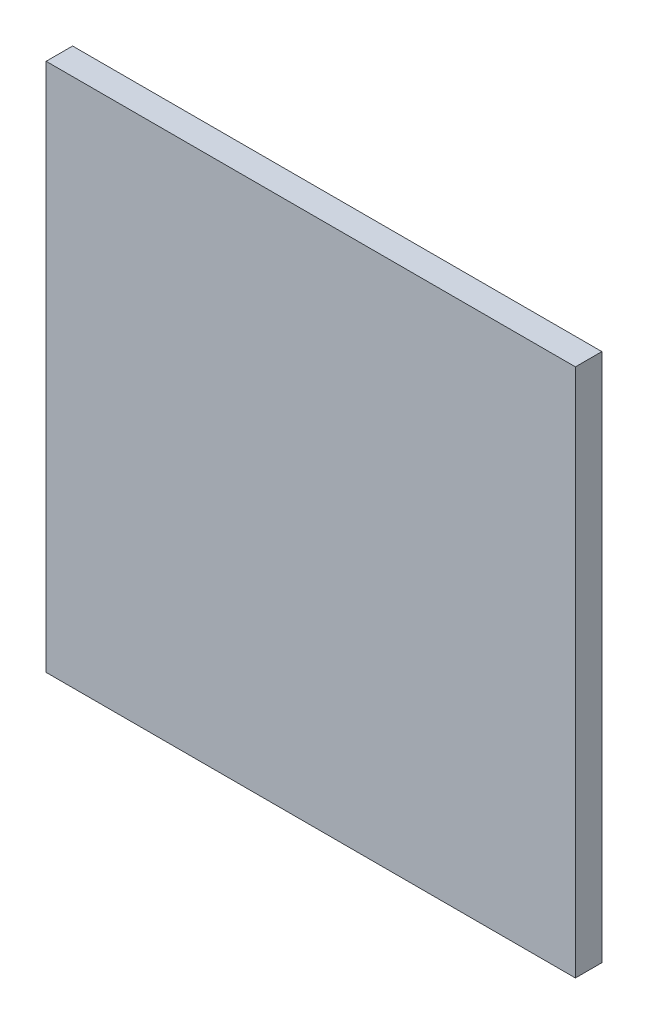
ISO-10303-21;
HEADER;
FILE_DESCRIPTION(('STEP AP214'),'2;1');
FILE_NAME('part.step','',(''),(''),'','','');
FILE_SCHEMA(('AUTOMOTIVE_DESIGN { 1 0 10303 214 1 1 1 1 }'));
ENDSEC;
DATA;
#1=APPLICATION_CONTEXT('core data for automotive mechanical design processes');
#2=APPLICATION_PROTOCOL_DEFINITION('international standard','automotive_design',2000,#1);
#3=PRODUCT_CONTEXT('',#1,'mechanical');
#4=PRODUCT('Part','Part','',(#3));
#5=PRODUCT_RELATED_PRODUCT_CATEGORY('part','',(#4));
#6=PRODUCT_DEFINITION_FORMATION('','',#4);
#7=PRODUCT_DEFINITION_CONTEXT('part definition',#1,'design');
#8=PRODUCT_DEFINITION('design','',#6,#7);
#9=PRODUCT_DEFINITION_SHAPE('','',#8);
#10=(LENGTH_UNIT() NAMED_UNIT(*) SI_UNIT(.MILLI.,.METRE.));
#11=(NAMED_UNIT(*) PLANE_ANGLE_UNIT() SI_UNIT($,.RADIAN.));
#12=(NAMED_UNIT(*) SI_UNIT($,.STERADIAN.) SOLID_ANGLE_UNIT());
#13=UNCERTAINTY_MEASURE_WITH_UNIT(LENGTH_MEASURE(1.E-05),#10,'distance_accuracy_value','');
#14=(GEOMETRIC_REPRESENTATION_CONTEXT(3) GLOBAL_UNCERTAINTY_ASSIGNED_CONTEXT((#13)) GLOBAL_UNIT_ASSIGNED_CONTEXT((#10,
#11,#12)) REPRESENTATION_CONTEXT('',''));
#15=CARTESIAN_POINT('',(0.,0.,0.));
#16=DIRECTION('',(0.,0.,1.));
#17=DIRECTION('',(1.,0.,0.));
#18=AXIS2_PLACEMENT_3D('',#15,#16,#17);
#19=CARTESIAN_POINT('',(0.,0.,5.));
#20=DIRECTION('',(1.,0.,0.));
#21=DIRECTION('',(0.,0.,-1.));
#22=AXIS2_PLACEMENT_3D('',#19,#20,#21);
#23=PLANE('',#22);
#24=DIRECTION('',(0.,-1.,0.));
#25=VECTOR('',#24,1.);
#26=CARTESIAN_POINT('',(0.,0.,0.));
#27=LINE('',#26,#25);
#28=CARTESIAN_POINT('',(0.,100.,0.));
#29=VERTEX_POINT('',#28);
#30=CARTESIAN_POINT('',(0.,0.,0.));
#31=VERTEX_POINT('',#30);
#32=EDGE_CURVE('E107',#29,#31,#27,.T.);
#33=ORIENTED_EDGE('',*,*,#32,.T.);
#34=DIRECTION('',(0.,0.,-1.));
#35=VECTOR('',#34,1.);
#36=CARTESIAN_POINT('',(0.,0.,5.));
#37=LINE('',#36,#35);
#38=CARTESIAN_POINT('',(0.,0.,5.));
#39=VERTEX_POINT('',#38);
#40=EDGE_CURVE('E11',#39,#31,#37,.T.);
#41=ORIENTED_EDGE('',*,*,#40,.F.);
#42=DIRECTION('',(0.,-1.,0.));
#43=VECTOR('',#42,1.);
#44=CARTESIAN_POINT('',(0.,0.,5.));
#45=LINE('',#44,#43);
#46=CARTESIAN_POINT('',(0.,100.,5.));
#47=VERTEX_POINT('',#46);
#48=EDGE_CURVE('E91',#47,#39,#45,.T.);
#49=ORIENTED_EDGE('',*,*,#48,.F.);
#50=DIRECTION('',(0.,0.,-1.));
#51=VECTOR('',#50,1.);
#52=CARTESIAN_POINT('',(0.,100.,5.));
#53=LINE('',#52,#51);
#54=EDGE_CURVE('E103',#47,#29,#53,.T.);
#55=ORIENTED_EDGE('',*,*,#54,.T.);
#56=EDGE_LOOP('',(#33,#41,#49,#55));
#57=FACE_BOUND('',#56,.T.);
#58=ADVANCED_FACE('F39',(#57),#23,.F.);
#59=CARTESIAN_POINT('',(0.,0.,5.));
#60=DIRECTION('',(0.,1.,0.));
#61=DIRECTION('',(0.,0.,1.));
#62=AXIS2_PLACEMENT_3D('',#59,#60,#61);
#63=PLANE('',#62);
#64=DIRECTION('',(1.,0.,0.));
#65=VECTOR('',#64,1.);
#66=CARTESIAN_POINT('',(0.,0.,0.));
#67=LINE('',#66,#65);
#68=CARTESIAN_POINT('',(100.,0.,0.));
#69=VERTEX_POINT('',#68);
#70=EDGE_CURVE('E96',#31,#69,#67,.T.);
#71=ORIENTED_EDGE('',*,*,#70,.T.);
#72=DIRECTION('',(0.,0.,-1.));
#73=VECTOR('',#72,1.);
#74=CARTESIAN_POINT('',(100.,0.,5.));
#75=LINE('',#74,#73);
#76=CARTESIAN_POINT('',(100.,0.,5.));
#77=VERTEX_POINT('',#76);
#78=EDGE_CURVE('E48',#77,#69,#75,.T.);
#79=ORIENTED_EDGE('',*,*,#78,.F.);
#80=DIRECTION('',(1.,0.,0.));
#81=VECTOR('',#80,1.);
#82=CARTESIAN_POINT('',(0.,0.,5.));
#83=LINE('',#82,#81);
#84=EDGE_CURVE('E86',#39,#77,#83,.T.);
#85=ORIENTED_EDGE('',*,*,#84,.F.);
#86=ORIENTED_EDGE('',*,*,#40,.T.);
#87=EDGE_LOOP('',(#71,#79,#85,#86));
#88=FACE_BOUND('',#87,.T.);
#89=ADVANCED_FACE('F95',(#88),#63,.F.);
#90=CARTESIAN_POINT('',(100.,0.,5.));
#91=DIRECTION('',(-1.,0.,0.));
#92=DIRECTION('',(0.,0.,1.));
#93=AXIS2_PLACEMENT_3D('',#90,#91,#92);
#94=PLANE('',#93);
#95=DIRECTION('',(0.,1.,0.));
#96=VECTOR('',#95,1.);
#97=CARTESIAN_POINT('',(100.,0.,0.));
#98=LINE('',#97,#96);
#99=CARTESIAN_POINT('',(100.,100.,0.));
#100=VERTEX_POINT('',#99);
#101=EDGE_CURVE('E73',#69,#100,#98,.T.);
#102=ORIENTED_EDGE('',*,*,#101,.T.);
#103=DIRECTION('',(0.,0.,-1.));
#104=VECTOR('',#103,1.);
#105=CARTESIAN_POINT('',(100.,100.,5.));
#106=LINE('',#105,#104);
#107=CARTESIAN_POINT('',(100.,100.,5.));
#108=VERTEX_POINT('',#107);
#109=EDGE_CURVE('E98',#108,#100,#106,.T.);
#110=ORIENTED_EDGE('',*,*,#109,.F.);
#111=DIRECTION('',(0.,1.,0.));
#112=VECTOR('',#111,1.);
#113=CARTESIAN_POINT('',(100.,0.,5.));
#114=LINE('',#113,#112);
#115=EDGE_CURVE('E89',#77,#108,#114,.T.);
#116=ORIENTED_EDGE('',*,*,#115,.F.);
#117=ORIENTED_EDGE('',*,*,#78,.T.);
#118=EDGE_LOOP('',(#102,#110,#116,#117));
#119=FACE_BOUND('',#118,.T.);
#120=ADVANCED_FACE('F99',(#119),#94,.F.);
#121=CARTESIAN_POINT('',(0.,100.,5.));
#122=DIRECTION('',(0.,-1.,0.));
#123=DIRECTION('',(0.,0.,-1.));
#124=AXIS2_PLACEMENT_3D('',#121,#122,#123);
#125=PLANE('',#124);
#126=DIRECTION('',(-1.,0.,0.));
#127=VECTOR('',#126,1.);
#128=CARTESIAN_POINT('',(0.,100.,0.));
#129=LINE('',#128,#127);
#130=EDGE_CURVE('E79',#100,#29,#129,.T.);
#131=ORIENTED_EDGE('',*,*,#130,.T.);
#132=ORIENTED_EDGE('',*,*,#54,.F.);
#133=DIRECTION('',(-1.,0.,0.));
#134=VECTOR('',#133,1.);
#135=CARTESIAN_POINT('',(0.,100.,5.));
#136=LINE('',#135,#134);
#137=EDGE_CURVE('E56',#108,#47,#136,.T.);
#138=ORIENTED_EDGE('',*,*,#137,.F.);
#139=ORIENTED_EDGE('',*,*,#109,.T.);
#140=EDGE_LOOP('',(#131,#132,#138,#139));
#141=FACE_BOUND('',#140,.T.);
#142=ADVANCED_FACE('F120',(#141),#125,.F.);
#143=CARTESIAN_POINT('',(0.,0.,5.));
#144=DIRECTION('',(0.,0.,-1.));
#145=DIRECTION('',(-1.,0.,0.));
#146=AXIS2_PLACEMENT_3D('',#143,#144,#145);
#147=PLANE('',#146);
#148=ORIENTED_EDGE('',*,*,#48,.T.);
#149=ORIENTED_EDGE('',*,*,#84,.T.);
#150=ORIENTED_EDGE('',*,*,#115,.T.);
#151=ORIENTED_EDGE('',*,*,#137,.T.);
#152=EDGE_LOOP('',(#148,#149,#150,#151));
#153=FACE_BOUND('',#152,.T.);
#154=ADVANCED_FACE('F87',(#153),#147,.F.);
#155=CARTESIAN_POINT('',(0.,0.,0.));
#156=DIRECTION('',(0.,0.,-1.));
#157=DIRECTION('',(-1.,0.,0.));
#158=AXIS2_PLACEMENT_3D('',#155,#156,#157);
#159=PLANE('',#158);
#160=ORIENTED_EDGE('',*,*,#32,.F.);
#161=ORIENTED_EDGE('',*,*,#130,.F.);
#162=ORIENTED_EDGE('',*,*,#101,.F.);
#163=ORIENTED_EDGE('',*,*,#70,.F.);
#164=EDGE_LOOP('',(#160,#161,#162,#163));
#165=FACE_BOUND('',#164,.T.);
#166=ADVANCED_FACE('F123',(#165),#159,.T.);
#167=CLOSED_SHELL('',(#58,#89,#120,#142,#154,#166));
#168=MANIFOLD_SOLID_BREP('B2',#167);
#169=ADVANCED_BREP_SHAPE_REPRESENTATION('',(#18,#168),#14);
#170=SHAPE_DEFINITION_REPRESENTATION(#9,#169);
ENDSEC;
END-ISO-10303-21;
